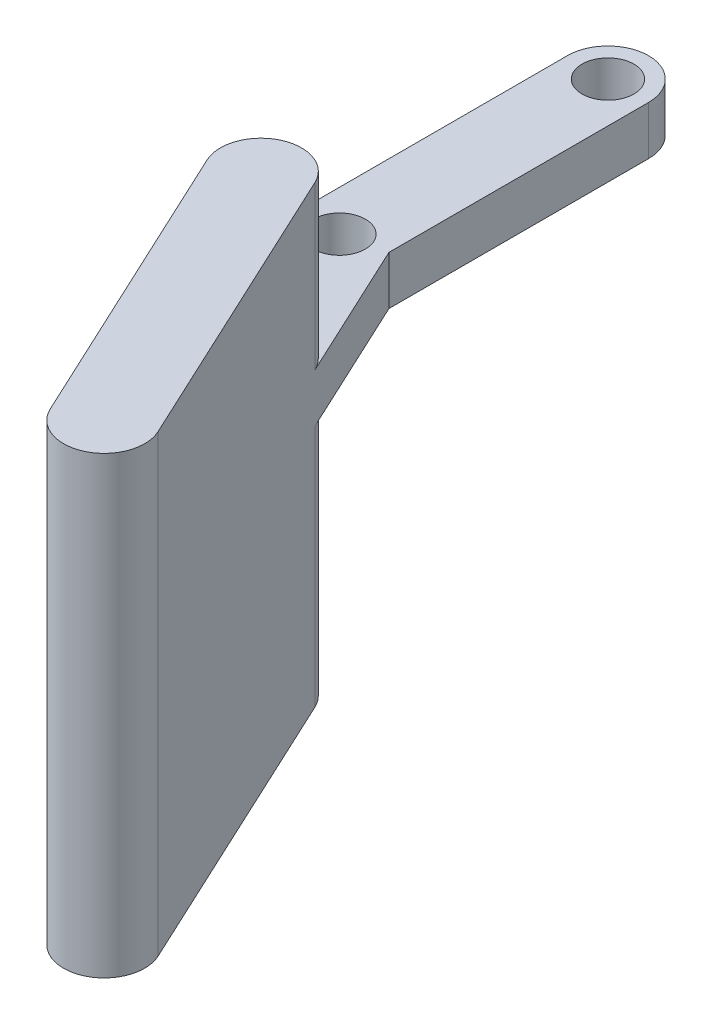
ISO-10303-21;
HEADER;
FILE_DESCRIPTION(('STEP AP214'),'2;1');
FILE_NAME('part.step','',(''),(''),'','','');
FILE_SCHEMA(('AUTOMOTIVE_DESIGN { 1 0 10303 214 1 1 1 1 }'));
ENDSEC;
DATA;
#1=APPLICATION_CONTEXT('core data for automotive mechanical design processes');
#2=APPLICATION_PROTOCOL_DEFINITION('international standard','automotive_design',2000,#1);
#3=PRODUCT_CONTEXT('',#1,'mechanical');
#4=PRODUCT('Part','Part','',(#3));
#5=PRODUCT_RELATED_PRODUCT_CATEGORY('part','',(#4));
#6=PRODUCT_DEFINITION_FORMATION('','',#4);
#7=PRODUCT_DEFINITION_CONTEXT('part definition',#1,'design');
#8=PRODUCT_DEFINITION('design','',#6,#7);
#9=PRODUCT_DEFINITION_SHAPE('','',#8);
#10=(LENGTH_UNIT() NAMED_UNIT(*) SI_UNIT(.MILLI.,.METRE.));
#11=(NAMED_UNIT(*) PLANE_ANGLE_UNIT() SI_UNIT($,.RADIAN.));
#12=(NAMED_UNIT(*) SI_UNIT($,.STERADIAN.) SOLID_ANGLE_UNIT());
#13=UNCERTAINTY_MEASURE_WITH_UNIT(LENGTH_MEASURE(1.E-05),#10,'distance_accuracy_value','');
#14=(GEOMETRIC_REPRESENTATION_CONTEXT(3) GLOBAL_UNCERTAINTY_ASSIGNED_CONTEXT((#13)) GLOBAL_UNIT_ASSIGNED_CONTEXT((#10,
#11,#12)) REPRESENTATION_CONTEXT('',''));
#15=CARTESIAN_POINT('',(0.,0.,0.));
#16=DIRECTION('',(0.,0.,1.));
#17=DIRECTION('',(1.,0.,0.));
#18=AXIS2_PLACEMENT_3D('',#15,#16,#17);
#19=CARTESIAN_POINT('',(0.,3.,16.5529453572468));
#20=DIRECTION('',(0.,-1.,0.));
#21=DIRECTION('',(0.,0.,-1.));
#22=AXIS2_PLACEMENT_3D('',#19,#20,#21);
#23=CYLINDRICAL_SURFACE('',#22,2.5);
#24=DIRECTION('',(0.,1.,0.));
#25=VECTOR('',#24,1.);
#26=CARTESIAN_POINT('',(-2.26545784998816,0.,17.6101590205747));
#27=LINE('',#26,#25);
#28=CARTESIAN_POINT('',(-2.26545784998816,0.,17.6101590205747));
#29=VERTEX_POINT('',#28);
#30=CARTESIAN_POINT('',(-2.26545784998816,3.,17.6101590205747));
#31=VERTEX_POINT('',#30);
#32=EDGE_CURVE('E219',#29,#31,#27,.T.);
#33=ORIENTED_EDGE('',*,*,#32,.T.);
#34=CARTESIAN_POINT('',(0.,3.,16.5529453572468));
#35=DIRECTION('',(0.,1.,0.));
#36=DIRECTION('',(0.,0.,1.));
#37=AXIS2_PLACEMENT_3D('',#34,#35,#36);
#38=CIRCLE('',#37,2.5);
#39=CARTESIAN_POINT('',(-2.5,3.,16.5529453572468));
#40=VERTEX_POINT('',#39);
#41=EDGE_CURVE('E241',#40,#31,#38,.T.);
#42=ORIENTED_EDGE('',*,*,#41,.F.);
#43=DIRECTION('',(0.,-1.,0.));
#44=VECTOR('',#43,1.);
#45=CARTESIAN_POINT('',(-2.5,3.,16.5529453572468));
#46=LINE('',#45,#44);
#47=CARTESIAN_POINT('',(-2.5,0.,16.5529453572468));
#48=VERTEX_POINT('',#47);
#49=EDGE_CURVE('E54',#40,#48,#46,.T.);
#50=ORIENTED_EDGE('',*,*,#49,.T.);
#51=CARTESIAN_POINT('',(0.,0.,16.5529453572468));
#52=DIRECTION('',(0.,1.,0.));
#53=DIRECTION('',(0.,0.,1.));
#54=AXIS2_PLACEMENT_3D('',#51,#52,#53);
#55=CIRCLE('',#54,2.5);
#56=EDGE_CURVE('E255',#48,#29,#55,.T.);
#57=ORIENTED_EDGE('',*,*,#56,.T.);
#58=EDGE_LOOP('',(#33,#42,#50,#57));
#59=FACE_BOUND('',#58,.T.);
#60=ADVANCED_FACE('F45',(#59),#23,.T.);
#61=CARTESIAN_POINT('',(0.,3.,0.));
#62=DIRECTION('',(0.,-1.,0.));
#63=DIRECTION('',(0.,0.,-1.));
#64=AXIS2_PLACEMENT_3D('',#61,#62,#63);
#65=CYLINDRICAL_SURFACE('',#64,2.5);
#66=CARTESIAN_POINT('',(0.,0.,0.));
#67=DIRECTION('',(0.,1.,0.));
#68=DIRECTION('',(0.,0.,1.));
#69=AXIS2_PLACEMENT_3D('',#66,#67,#68);
#70=CIRCLE('',#69,2.5);
#71=CARTESIAN_POINT('',(2.5,0.,0.));
#72=VERTEX_POINT('',#71);
#73=CARTESIAN_POINT('',(-2.5,0.,0.));
#74=VERTEX_POINT('',#73);
#75=EDGE_CURVE('E232',#72,#74,#70,.T.);
#76=ORIENTED_EDGE('',*,*,#75,.T.);
#77=DIRECTION('',(0.,-1.,0.));
#78=VECTOR('',#77,1.);
#79=CARTESIAN_POINT('',(-2.5,3.,0.));
#80=LINE('',#79,#78);
#81=CARTESIAN_POINT('',(-2.5,3.,0.));
#82=VERTEX_POINT('',#81);
#83=EDGE_CURVE('E11',#82,#74,#80,.T.);
#84=ORIENTED_EDGE('',*,*,#83,.F.);
#85=CARTESIAN_POINT('',(0.,3.,0.));
#86=DIRECTION('',(0.,1.,0.));
#87=DIRECTION('',(0.,0.,1.));
#88=AXIS2_PLACEMENT_3D('',#85,#86,#87);
#89=CIRCLE('',#88,2.5);
#90=CARTESIAN_POINT('',(2.5,3.,0.));
#91=VERTEX_POINT('',#90);
#92=EDGE_CURVE('E233',#91,#82,#89,.T.);
#93=ORIENTED_EDGE('',*,*,#92,.F.);
#94=DIRECTION('',(0.,-1.,0.));
#95=VECTOR('',#94,1.);
#96=CARTESIAN_POINT('',(2.5,3.,0.));
#97=LINE('',#96,#95);
#98=EDGE_CURVE('E248',#91,#72,#97,.T.);
#99=ORIENTED_EDGE('',*,*,#98,.T.);
#100=EDGE_LOOP('',(#76,#84,#93,#99));
#101=FACE_BOUND('',#100,.T.);
#102=ADVANCED_FACE('F47',(#101),#65,.T.);
#103=CARTESIAN_POINT('',(-2.5,3.,0.));
#104=DIRECTION('',(1.,0.,0.));
#105=DIRECTION('',(0.,0.,-1.));
#106=AXIS2_PLACEMENT_3D('',#103,#104,#105);
#107=PLANE('',#106);
#108=DIRECTION('',(0.,0.,1.));
#109=VECTOR('',#108,1.);
#110=CARTESIAN_POINT('',(-2.5,0.,0.));
#111=LINE('',#110,#109);
#112=EDGE_CURVE('E252',#74,#48,#111,.T.);
#113=ORIENTED_EDGE('',*,*,#112,.T.);
#114=ORIENTED_EDGE('',*,*,#49,.F.);
#115=DIRECTION('',(0.,0.,1.));
#116=VECTOR('',#115,1.);
#117=CARTESIAN_POINT('',(-2.5,3.,0.));
#118=LINE('',#117,#116);
#119=EDGE_CURVE('E237',#82,#40,#118,.T.);
#120=ORIENTED_EDGE('',*,*,#119,.F.);
#121=ORIENTED_EDGE('',*,*,#83,.T.);
#122=EDGE_LOOP('',(#113,#114,#120,#121));
#123=FACE_BOUND('',#122,.T.);
#124=ADVANCED_FACE('F302',(#123),#107,.F.);
#125=CARTESIAN_POINT('',(2.5,3.,0.));
#126=DIRECTION('',(-1.,0.,0.));
#127=DIRECTION('',(0.,0.,1.));
#128=AXIS2_PLACEMENT_3D('',#125,#126,#127);
#129=PLANE('',#128);
#130=DIRECTION('',(0.,0.,-1.));
#131=VECTOR('',#130,1.);
#132=CARTESIAN_POINT('',(2.5,3.,0.));
#133=LINE('',#132,#131);
#134=CARTESIAN_POINT('',(2.5,3.,15.998322015373));
#135=VERTEX_POINT('',#134);
#136=EDGE_CURVE('E245',#135,#91,#133,.T.);
#137=ORIENTED_EDGE('',*,*,#136,.F.);
#138=DIRECTION('',(0.,-1.,0.));
#139=VECTOR('',#138,1.);
#140=CARTESIAN_POINT('',(2.5,3.,15.998322015373));
#141=LINE('',#140,#139);
#142=CARTESIAN_POINT('',(2.5,0.,15.998322015373));
#143=VERTEX_POINT('',#142);
#144=EDGE_CURVE('E141',#135,#143,#141,.T.);
#145=ORIENTED_EDGE('',*,*,#144,.T.);
#146=DIRECTION('',(0.,0.,-1.));
#147=VECTOR('',#146,1.);
#148=CARTESIAN_POINT('',(2.5,0.,0.));
#149=LINE('',#148,#147);
#150=EDGE_CURVE('E238',#143,#72,#149,.T.);
#151=ORIENTED_EDGE('',*,*,#150,.T.);
#152=ORIENTED_EDGE('',*,*,#98,.F.);
#153=EDGE_LOOP('',(#137,#145,#151,#152));
#154=FACE_BOUND('',#153,.T.);
#155=ADVANCED_FACE('F305',(#154),#129,.F.);
#156=CARTESIAN_POINT('',(0.,3.,0.));
#157=DIRECTION('',(0.,1.,0.));
#158=DIRECTION('',(0.,0.,1.));
#159=AXIS2_PLACEMENT_3D('',#156,#157,#158);
#160=PLANE('',#159);
#161=CARTESIAN_POINT('',(4.22885465331121,3.,25.6147767571995));
#162=DIRECTION('',(0.,1.,0.));
#163=DIRECTION('',(0.,0.,1.));
#164=AXIS2_PLACEMENT_3D('',#161,#162,#163);
#165=CIRCLE('',#164,2.5);
#166=CARTESIAN_POINT('',(6.49431250329938,3.,24.5575630938717));
#167=VERTEX_POINT('',#166);
#168=CARTESIAN_POINT('',(1.96339680332305,3.,26.6719904205273));
#169=VERTEX_POINT('',#168);
#170=EDGE_CURVE('E61',#167,#169,#165,.T.);
#171=ORIENTED_EDGE('',*,*,#170,.F.);
#172=DIRECTION('',(-0.422885465331122,0.,-0.906183139995267));
#173=VECTOR('',#172,1.);
#174=CARTESIAN_POINT('',(2.26545784998817,3.,15.495731693919));
#175=LINE('',#174,#173);
#176=EDGE_CURVE('E216',#167,#135,#175,.T.);
#177=ORIENTED_EDGE('',*,*,#176,.T.);
#178=ORIENTED_EDGE('',*,*,#136,.T.);
#179=ORIENTED_EDGE('',*,*,#92,.T.);
#180=ORIENTED_EDGE('',*,*,#119,.T.);
#181=ORIENTED_EDGE('',*,*,#41,.T.);
#182=DIRECTION('',(0.422885465331122,0.,0.906183139995267));
#183=VECTOR('',#182,1.);
#184=CARTESIAN_POINT('',(-2.26545784998816,3.,17.6101590205747));
#185=LINE('',#184,#183);
#186=EDGE_CURVE('E200',#31,#169,#185,.T.);
#187=ORIENTED_EDGE('',*,*,#186,.T.);
#188=EDGE_LOOP('',(#171,#177,#178,#179,#180,#181,#187));
#189=FACE_BOUND('',#188,.T.);
#190=CARTESIAN_POINT('',(0.,3.,0.));
#191=DIRECTION('',(0.,1.,0.));
#192=DIRECTION('',(0.,0.,1.));
#193=AXIS2_PLACEMENT_3D('',#190,#191,#192);
#194=CIRCLE('',#193,1.6);
#195=CARTESIAN_POINT('',(0.,3.,1.6));
#196=VERTEX_POINT('',#195);
#197=EDGE_CURVE('E201',#196,#196,#194,.T.);
#198=ORIENTED_EDGE('',*,*,#197,.F.);
#199=EDGE_LOOP('',(#198));
#200=FACE_BOUND('',#199,.T.);
#201=CARTESIAN_POINT('',(0.,3.,16.5529453572468));
#202=DIRECTION('',(0.,1.,0.));
#203=DIRECTION('',(0.,0.,1.));
#204=AXIS2_PLACEMENT_3D('',#201,#202,#203);
#205=CIRCLE('',#204,1.6);
#206=CARTESIAN_POINT('',(0.,3.,18.1529453572468));
#207=VERTEX_POINT('',#206);
#208=EDGE_CURVE('E205',#207,#207,#205,.T.);
#209=ORIENTED_EDGE('',*,*,#208,.F.);
#210=EDGE_LOOP('',(#209));
#211=FACE_BOUND('',#210,.T.);
#212=ADVANCED_FACE('F309',(#189,#200,#211),#160,.T.);
#213=CARTESIAN_POINT('',(0.,0.,0.));
#214=DIRECTION('',(0.,1.,0.));
#215=DIRECTION('',(0.,0.,1.));
#216=AXIS2_PLACEMENT_3D('',#213,#214,#215);
#217=PLANE('',#216);
#218=CARTESIAN_POINT('',(4.22885465271009,0.,25.61477675748));
#219=DIRECTION('',(0.,-1.,0.));
#220=DIRECTION('',(0.,0.,-1.));
#221=AXIS2_PLACEMENT_3D('',#218,#219,#220);
#222=CIRCLE('',#221,2.49999999999999);
#223=CARTESIAN_POINT('',(1.96339680332305,0.,26.6719904205273));
#224=VERTEX_POINT('',#223);
#225=CARTESIAN_POINT('',(6.49431250266319,0.,24.5575630940771));
#226=VERTEX_POINT('',#225);
#227=EDGE_CURVE('E69',#224,#226,#222,.T.);
#228=ORIENTED_EDGE('',*,*,#227,.F.);
#229=DIRECTION('',(0.422885465331122,0.,0.906183139995267));
#230=VECTOR('',#229,1.);
#231=CARTESIAN_POINT('',(-2.26545784998816,0.,17.6101590205747));
#232=LINE('',#231,#230);
#233=EDGE_CURVE('E212',#29,#224,#232,.T.);
#234=ORIENTED_EDGE('',*,*,#233,.F.);
#235=ORIENTED_EDGE('',*,*,#56,.F.);
#236=ORIENTED_EDGE('',*,*,#112,.F.);
#237=ORIENTED_EDGE('',*,*,#75,.F.);
#238=ORIENTED_EDGE('',*,*,#150,.F.);
#239=DIRECTION('',(-0.422885465331122,0.,-0.906183139995267));
#240=VECTOR('',#239,1.);
#241=CARTESIAN_POINT('',(2.26545784998817,0.,15.495731693919));
#242=LINE('',#241,#240);
#243=EDGE_CURVE('E215',#226,#143,#242,.T.);
#244=ORIENTED_EDGE('',*,*,#243,.F.);
#245=EDGE_LOOP('',(#228,#234,#235,#236,#237,#238,#244));
#246=FACE_BOUND('',#245,.T.);
#247=CARTESIAN_POINT('',(0.,0.,0.));
#248=DIRECTION('',(0.,1.,0.));
#249=DIRECTION('',(0.,0.,1.));
#250=AXIS2_PLACEMENT_3D('',#247,#248,#249);
#251=CIRCLE('',#250,1.6);
#252=CARTESIAN_POINT('',(0.,0.,1.6));
#253=VERTEX_POINT('',#252);
#254=EDGE_CURVE('E196',#253,#253,#251,.T.);
#255=ORIENTED_EDGE('',*,*,#254,.T.);
#256=EDGE_LOOP('',(#255));
#257=FACE_BOUND('',#256,.T.);
#258=CARTESIAN_POINT('',(0.,0.,16.5529453572468));
#259=DIRECTION('',(0.,1.,0.));
#260=DIRECTION('',(0.,0.,1.));
#261=AXIS2_PLACEMENT_3D('',#258,#259,#260);
#262=CIRCLE('',#261,1.6);
#263=CARTESIAN_POINT('',(0.,0.,18.1529453572468));
#264=VERTEX_POINT('',#263);
#265=EDGE_CURVE('E195',#264,#264,#262,.T.);
#266=ORIENTED_EDGE('',*,*,#265,.T.);
#267=EDGE_LOOP('',(#266));
#268=FACE_BOUND('',#267,.T.);
#269=ADVANCED_FACE('F270',(#246,#257,#268),#217,.F.);
#270=CARTESIAN_POINT('',(2.26545784998817,0.,15.495731693919));
#271=DIRECTION('',(0.906183139995266,0.,-0.422885465331121));
#272=DIRECTION('',(-0.422885465331122,0.,-0.906183139995267));
#273=AXIS2_PLACEMENT_3D('',#270,#271,#272);
#274=PLANE('',#273);
#275=ORIENTED_EDGE('',*,*,#144,.F.);
#276=ORIENTED_EDGE('',*,*,#176,.F.);
#277=DIRECTION('',(0.,-1.,0.));
#278=VECTOR('',#277,1.);
#279=CARTESIAN_POINT('',(6.49431250329938,13.,24.5575630938717));
#280=LINE('',#279,#278);
#281=CARTESIAN_POINT('',(6.49431250329938,13.,24.5575630938717));
#282=VERTEX_POINT('',#281);
#283=EDGE_CURVE('E149',#282,#167,#280,.T.);
#284=ORIENTED_EDGE('',*,*,#283,.F.);
#285=DIRECTION('',(-0.422885465331121,0.,-0.906183139995267));
#286=VECTOR('',#285,1.);
#287=CARTESIAN_POINT('',(14.9520218099218,13.,42.681225893777));
#288=LINE('',#287,#286);
#289=CARTESIAN_POINT('',(14.9520218099218,13.,42.681225893777));
#290=VERTEX_POINT('',#289);
#291=EDGE_CURVE('E145',#290,#282,#288,.T.);
#292=ORIENTED_EDGE('',*,*,#291,.F.);
#293=DIRECTION('',(0.,1.,0.));
#294=VECTOR('',#293,1.);
#295=CARTESIAN_POINT('',(14.9520218099218,0.,42.681225893777));
#296=LINE('',#295,#294);
#297=CARTESIAN_POINT('',(14.9520218098867,-15.,42.6812258937019));
#298=VERTEX_POINT('',#297);
#299=EDGE_CURVE('E130',#298,#290,#296,.T.);
#300=ORIENTED_EDGE('',*,*,#299,.F.);
#301=DIRECTION('',(0.422885465361178,0.,0.90618313998124));
#302=VECTOR('',#301,1.);
#303=CARTESIAN_POINT('',(14.9520218098867,-15.,42.6812258937019));
#304=LINE('',#303,#302);
#305=CARTESIAN_POINT('',(6.49431250266319,-15.,24.5575630940771));
#306=VERTEX_POINT('',#305);
#307=EDGE_CURVE('E182',#306,#298,#304,.T.);
#308=ORIENTED_EDGE('',*,*,#307,.F.);
#309=DIRECTION('',(0.,1.,0.));
#310=VECTOR('',#309,1.);
#311=CARTESIAN_POINT('',(6.49431250266319,-15.,24.5575630940771));
#312=LINE('',#311,#310);
#313=EDGE_CURVE('E185',#306,#226,#312,.T.);
#314=ORIENTED_EDGE('',*,*,#313,.T.);
#315=ORIENTED_EDGE('',*,*,#243,.T.);
#316=EDGE_LOOP('',(#275,#276,#284,#292,#300,#308,#314,#315));
#317=FACE_BOUND('',#316,.T.);
#318=ADVANCED_FACE('F147',(#317),#274,.T.);
#319=CARTESIAN_POINT('',(12.6865639599336,0.,43.7384395571048));
#320=DIRECTION('',(0.,1.,0.));
#321=DIRECTION('',(0.,0.,1.));
#322=AXIS2_PLACEMENT_3D('',#319,#320,#321);
#323=CYLINDRICAL_SURFACE('',#322,2.5);
#324=ORIENTED_EDGE('',*,*,#299,.T.);
#325=CARTESIAN_POINT('',(12.6865639599336,13.,43.7384395571048));
#326=DIRECTION('',(0.,1.,0.));
#327=DIRECTION('',(0.,0.,1.));
#328=AXIS2_PLACEMENT_3D('',#325,#326,#327);
#329=CIRCLE('',#328,2.5);
#330=CARTESIAN_POINT('',(10.4211061099455,13.,44.7956532204326));
#331=VERTEX_POINT('',#330);
#332=EDGE_CURVE('E134',#331,#290,#329,.T.);
#333=ORIENTED_EDGE('',*,*,#332,.F.);
#334=DIRECTION('',(0.,1.,0.));
#335=VECTOR('',#334,1.);
#336=CARTESIAN_POINT('',(10.4211061099455,0.,44.7956532204326));
#337=LINE('',#336,#335);
#338=CARTESIAN_POINT('',(10.4211061099805,-15.,44.7956532205078));
#339=VERTEX_POINT('',#338);
#340=EDGE_CURVE('E142',#339,#331,#337,.T.);
#341=ORIENTED_EDGE('',*,*,#340,.F.);
#342=CARTESIAN_POINT('',(12.6865639599336,-15.,43.7384395571048));
#343=DIRECTION('',(0.,-1.,0.));
#344=DIRECTION('',(0.,0.,-1.));
#345=AXIS2_PLACEMENT_3D('',#342,#343,#344);
#346=CIRCLE('',#345,2.5);
#347=EDGE_CURVE('E136',#298,#339,#346,.T.);
#348=ORIENTED_EDGE('',*,*,#347,.F.);
#349=EDGE_LOOP('',(#324,#333,#341,#348));
#350=FACE_BOUND('',#349,.T.);
#351=ADVANCED_FACE('F132',(#350),#323,.T.);
#352=CARTESIAN_POINT('',(-2.26545784998816,0.,17.6101590205747));
#353=DIRECTION('',(-0.906183139995266,0.,0.422885465331121));
#354=DIRECTION('',(0.422885465331122,0.,0.906183139995267));
#355=AXIS2_PLACEMENT_3D('',#352,#353,#354);
#356=PLANE('',#355);
#357=ORIENTED_EDGE('',*,*,#186,.F.);
#358=ORIENTED_EDGE('',*,*,#32,.F.);
#359=ORIENTED_EDGE('',*,*,#233,.T.);
#360=DIRECTION('',(0.,1.,0.));
#361=VECTOR('',#360,1.);
#362=CARTESIAN_POINT('',(1.963396802757,-15.,26.671990420883));
#363=LINE('',#362,#361);
#364=CARTESIAN_POINT('',(1.963396802757,-15.,26.671990420883));
#365=VERTEX_POINT('',#364);
#366=EDGE_CURVE('E191',#365,#224,#363,.T.);
#367=ORIENTED_EDGE('',*,*,#366,.F.);
#368=DIRECTION('',(-0.422885465361177,0.,-0.90618313998124));
#369=VECTOR('',#368,1.);
#370=CARTESIAN_POINT('',(10.4211061099805,-15.,44.7956532205078));
#371=LINE('',#370,#369);
#372=EDGE_CURVE('E176',#339,#365,#371,.T.);
#373=ORIENTED_EDGE('',*,*,#372,.F.);
#374=ORIENTED_EDGE('',*,*,#340,.T.);
#375=DIRECTION('',(0.422885465331122,0.,0.906183139995266));
#376=VECTOR('',#375,1.);
#377=CARTESIAN_POINT('',(10.4211061099455,13.,44.7956532204326));
#378=LINE('',#377,#376);
#379=CARTESIAN_POINT('',(1.96339680332305,13.,26.6719904205273));
#380=VERTEX_POINT('',#379);
#381=EDGE_CURVE('E158',#380,#331,#378,.T.);
#382=ORIENTED_EDGE('',*,*,#381,.F.);
#383=DIRECTION('',(0.,-1.,0.));
#384=VECTOR('',#383,1.);
#385=CARTESIAN_POINT('',(1.96339680332305,13.,26.6719904205273));
#386=LINE('',#385,#384);
#387=EDGE_CURVE('E167',#380,#169,#386,.T.);
#388=ORIENTED_EDGE('',*,*,#387,.T.);
#389=EDGE_LOOP('',(#357,#358,#359,#367,#373,#374,#382,#388));
#390=FACE_BOUND('',#389,.T.);
#391=ADVANCED_FACE('F275',(#390),#356,.T.);
#392=CARTESIAN_POINT('',(0.,0.,16.5529453572468));
#393=DIRECTION('',(0.,1.,0.));
#394=DIRECTION('',(0.,0.,1.));
#395=AXIS2_PLACEMENT_3D('',#392,#393,#394);
#396=CYLINDRICAL_SURFACE('',#395,1.6);
#397=ORIENTED_EDGE('',*,*,#265,.F.);
#398=EDGE_LOOP('',(#397));
#399=FACE_BOUND('',#398,.T.);
#400=ORIENTED_EDGE('',*,*,#208,.T.);
#401=EDGE_LOOP('',(#400));
#402=FACE_BOUND('',#401,.T.);
#403=ADVANCED_FACE('F323',(#399,#402),#396,.F.);
#404=CARTESIAN_POINT('',(0.,0.,0.));
#405=DIRECTION('',(0.,1.,0.));
#406=DIRECTION('',(0.,0.,1.));
#407=AXIS2_PLACEMENT_3D('',#404,#405,#406);
#408=CYLINDRICAL_SURFACE('',#407,1.6);
#409=ORIENTED_EDGE('',*,*,#254,.F.);
#410=EDGE_LOOP('',(#409));
#411=FACE_BOUND('',#410,.T.);
#412=ORIENTED_EDGE('',*,*,#197,.T.);
#413=EDGE_LOOP('',(#412));
#414=FACE_BOUND('',#413,.T.);
#415=ADVANCED_FACE('F325',(#411,#414),#408,.F.);
#416=CARTESIAN_POINT('',(4.22885465271009,-15.,25.61477675748));
#417=DIRECTION('',(0.,1.,0.));
#418=DIRECTION('',(0.,0.,1.));
#419=AXIS2_PLACEMENT_3D('',#416,#417,#418);
#420=CYLINDRICAL_SURFACE('',#419,2.49999999999999);
#421=ORIENTED_EDGE('',*,*,#227,.T.);
#422=ORIENTED_EDGE('',*,*,#313,.F.);
#423=CARTESIAN_POINT('',(4.22885465271009,-15.,25.61477675748));
#424=DIRECTION('',(0.,-1.,0.));
#425=DIRECTION('',(0.,0.,-1.));
#426=AXIS2_PLACEMENT_3D('',#423,#424,#425);
#427=CIRCLE('',#426,2.49999999999999);
#428=EDGE_CURVE('E179',#365,#306,#427,.T.);
#429=ORIENTED_EDGE('',*,*,#428,.F.);
#430=ORIENTED_EDGE('',*,*,#366,.T.);
#431=EDGE_LOOP('',(#421,#422,#429,#430));
#432=FACE_BOUND('',#431,.T.);
#433=ADVANCED_FACE('F279',(#432),#420,.T.);
#434=CARTESIAN_POINT('',(12.6865639599336,-15.,43.7384395571048));
#435=DIRECTION('',(0.,-1.,0.));
#436=DIRECTION('',(0.,0.,-1.));
#437=AXIS2_PLACEMENT_3D('',#434,#435,#436);
#438=PLANE('',#437);
#439=ORIENTED_EDGE('',*,*,#347,.T.);
#440=ORIENTED_EDGE('',*,*,#372,.T.);
#441=ORIENTED_EDGE('',*,*,#428,.T.);
#442=ORIENTED_EDGE('',*,*,#307,.T.);
#443=EDGE_LOOP('',(#439,#440,#441,#442));
#444=FACE_BOUND('',#443,.T.);
#445=ADVANCED_FACE('F282',(#444),#438,.T.);
#446=CARTESIAN_POINT('',(4.22885465331121,13.,25.6147767571995));
#447=DIRECTION('',(0.,-1.,0.));
#448=DIRECTION('',(0.,0.,-1.));
#449=AXIS2_PLACEMENT_3D('',#446,#447,#448);
#450=CYLINDRICAL_SURFACE('',#449,2.5);
#451=ORIENTED_EDGE('',*,*,#170,.T.);
#452=ORIENTED_EDGE('',*,*,#387,.F.);
#453=CARTESIAN_POINT('',(4.22885465331121,13.,25.6147767571995));
#454=DIRECTION('',(0.,1.,0.));
#455=DIRECTION('',(0.,0.,1.));
#456=AXIS2_PLACEMENT_3D('',#453,#454,#455);
#457=CIRCLE('',#456,2.5);
#458=EDGE_CURVE('E153',#282,#380,#457,.T.);
#459=ORIENTED_EDGE('',*,*,#458,.F.);
#460=ORIENTED_EDGE('',*,*,#283,.T.);
#461=EDGE_LOOP('',(#451,#452,#459,#460));
#462=FACE_BOUND('',#461,.T.);
#463=ADVANCED_FACE('F285',(#462),#450,.T.);
#464=CARTESIAN_POINT('',(12.6865639599336,13.,43.7384395571048));
#465=DIRECTION('',(0.,1.,0.));
#466=DIRECTION('',(0.,0.,1.));
#467=AXIS2_PLACEMENT_3D('',#464,#465,#466);
#468=PLANE('',#467);
#469=ORIENTED_EDGE('',*,*,#332,.T.);
#470=ORIENTED_EDGE('',*,*,#291,.T.);
#471=ORIENTED_EDGE('',*,*,#458,.T.);
#472=ORIENTED_EDGE('',*,*,#381,.T.);
#473=EDGE_LOOP('',(#469,#470,#471,#472));
#474=FACE_BOUND('',#473,.T.);
#475=ADVANCED_FACE('F156',(#474),#468,.T.);
#476=CLOSED_SHELL('',(#60,#102,#124,#155,#212,#269,#318,#351,#391,#403,#415,#433,#445,#463,#475));
#477=MANIFOLD_SOLID_BREP('B2',#476);
#478=ADVANCED_BREP_SHAPE_REPRESENTATION('',(#18,#477),#14);
#479=SHAPE_DEFINITION_REPRESENTATION(#9,#478);
ENDSEC;
END-ISO-10303-21;
